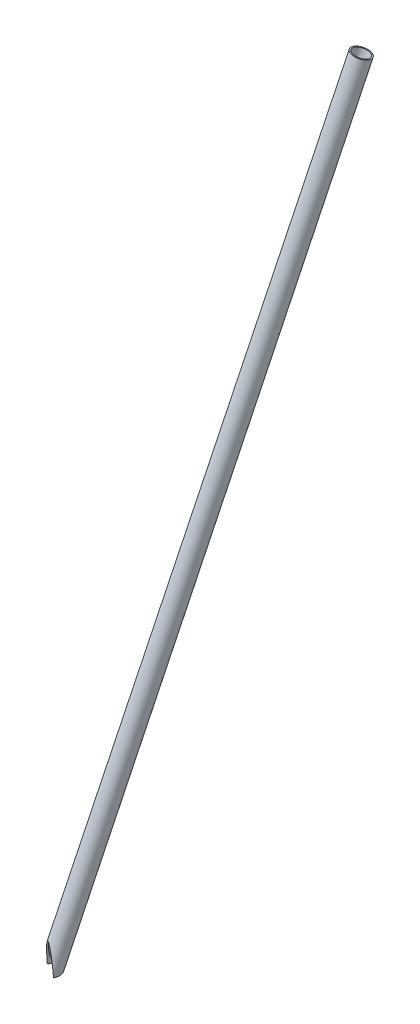
ISO-10303-21;
HEADER;
FILE_DESCRIPTION(('STEP AP214'),'2;1');
FILE_NAME('part.step','',(''),(''),'','','');
FILE_SCHEMA(('AUTOMOTIVE_DESIGN { 1 0 10303 214 1 1 1 1 }'));
ENDSEC;
DATA;
#1=APPLICATION_CONTEXT('core data for automotive mechanical design processes');
#2=APPLICATION_PROTOCOL_DEFINITION('international standard','automotive_design',2000,#1);
#3=PRODUCT_CONTEXT('',#1,'mechanical');
#4=PRODUCT('Part','Part','',(#3));
#5=PRODUCT_RELATED_PRODUCT_CATEGORY('part','',(#4));
#6=PRODUCT_DEFINITION_FORMATION('','',#4);
#7=PRODUCT_DEFINITION_CONTEXT('part definition',#1,'design');
#8=PRODUCT_DEFINITION('design','',#6,#7);
#9=PRODUCT_DEFINITION_SHAPE('','',#8);
#10=(LENGTH_UNIT() NAMED_UNIT(*) SI_UNIT(.MILLI.,.METRE.));
#11=(NAMED_UNIT(*) PLANE_ANGLE_UNIT() SI_UNIT($,.RADIAN.));
#12=(NAMED_UNIT(*) SI_UNIT($,.STERADIAN.) SOLID_ANGLE_UNIT());
#13=UNCERTAINTY_MEASURE_WITH_UNIT(LENGTH_MEASURE(1.E-05),#10,'distance_accuracy_value','');
#14=(GEOMETRIC_REPRESENTATION_CONTEXT(3) GLOBAL_UNCERTAINTY_ASSIGNED_CONTEXT((#13)) GLOBAL_UNIT_ASSIGNED_CONTEXT((#10,
#11,#12)) REPRESENTATION_CONTEXT('',''));
#15=CARTESIAN_POINT('',(0.,0.,0.));
#16=DIRECTION('',(0.,0.,1.));
#17=DIRECTION('',(1.,0.,0.));
#18=AXIS2_PLACEMENT_3D('',#15,#16,#17);
#19=CARTESIAN_POINT('',(-115.,920.,-1946.51325703663));
#20=DIRECTION('',(-0.140336447675245,-0.956366902675742,0.256257739239816));
#21=DIRECTION('',(0.,-0.258819045102517,-0.965925826289069));
#22=AXIS2_PLACEMENT_3D('',#19,#20,#21);
#23=CYLINDRICAL_SURFACE('',#22,9.39999999999998);
#24=CARTESIAN_POINT('',(-115.,920.,-1946.51325703663));
#25=DIRECTION('',(0.140336447675245,0.956366902675757,-0.25625773923976));
#26=DIRECTION('',(0.,0.258819045102461,0.965925826289084));
#27=AXIS2_PLACEMENT_3D('',#24,#25,#26);
#28=CIRCLE('',#27,9.39999999999998);
#29=CARTESIAN_POINT('',(-115.,922.432899023963,-1937.43355426951));
#30=VERTEX_POINT('',#29);
#31=EDGE_CURVE('E82',#30,#30,#28,.T.);
#32=ORIENTED_EDGE('',*,*,#31,.T.);
#33=EDGE_LOOP('',(#32));
#34=FACE_BOUND('',#33,.T.);
#35=CARTESIAN_POINT('',(-249.187093715794,3.10690676470209,-1710.56408925442));
#36=CARTESIAN_POINT('',(-248.92508342383,3.08321310541061,-1710.55773909982));
#37=CARTESIAN_POINT('',(-248.663002634256,3.06270874705635,-1710.54082360263));
#38=CARTESIAN_POINT('',(-248.140694326603,3.02706388530787,-1710.48565682954));
#39=CARTESIAN_POINT('',(-247.88046719588,3.01192447255609,-1710.44740121945));
#40=CARTESIAN_POINT('',(-247.363593267322,2.98623599681016,-1710.34952661938));
#41=CARTESIAN_POINT('',(-247.106949714954,2.97569086280886,-1710.28988942315));
#42=CARTESIAN_POINT('',(-246.599385985328,2.95864335209849,-1710.14948507557));
#43=CARTESIAN_POINT('',(-246.348465496006,2.95214075444945,-1710.06871907932));
#44=CARTESIAN_POINT('',(-245.8541567601,2.94278079040517,-1709.88647935129));
#45=CARTESIAN_POINT('',(-245.61076934013,2.93992382267563,-1709.78500335617));
#46=CARTESIAN_POINT('',(-245.13334470038,2.9376101096076,-1709.56198862529));
#47=CARTESIAN_POINT('',(-244.899307604027,2.93815340913886,-1709.4404496248));
#48=CARTESIAN_POINT('',(-244.442355052878,2.94253110033467,-1709.17818705773));
#49=CARTESIAN_POINT('',(-244.21943670936,2.94636463241379,-1709.03746850996));
#50=CARTESIAN_POINT('',(-243.786257716314,2.95734601101924,-1708.73785670425));
#51=CARTESIAN_POINT('',(-243.575996963565,2.96449383051386,-1708.57896359455));
#52=CARTESIAN_POINT('',(-243.171046714164,2.98220078496964,-1708.24540111253));
#53=CARTESIAN_POINT('',(-242.97625733425,2.99273535975692,-1708.07085165632));
#54=CARTESIAN_POINT('',(-242.601906333155,3.01752860192387,-1707.70636870131));
#55=CARTESIAN_POINT('',(-242.42234470325,3.03178726716954,-1707.51643521134));
#56=CARTESIAN_POINT('',(-242.079554782849,3.06449054861608,-1707.12261715733));
#57=CARTESIAN_POINT('',(-241.916330478228,3.0829361827568,-1706.9187292091));
#58=CARTESIAN_POINT('',(-241.607254112915,3.12465611158026,-1706.49865439916));
#59=CARTESIAN_POINT('',(-241.461402003459,3.14793039270847,-1706.28246757197));
#60=CARTESIAN_POINT('',(-241.186720652856,3.2004018202152,-1705.83762372278));
#61=CARTESIAN_POINT('',(-241.058048444121,3.22964813903503,-1705.60887551418));
#62=CARTESIAN_POINT('',(-240.819892021037,3.29511783795351,-1705.14253198881));
#63=CARTESIAN_POINT('',(-240.710409229458,3.33134173497623,-1704.90493601762));
#64=CARTESIAN_POINT('',(-240.511157657118,3.41230049337391,-1704.42301062551));
#65=CARTESIAN_POINT('',(-240.421389308705,3.45703554136223,-1704.17868105706));
#66=CARTESIAN_POINT('',(-240.261923480868,3.5569820724605,-1703.68567151367));
#67=CARTESIAN_POINT('',(-240.192221650508,3.61219128019081,-1703.43699249422));
#68=CARTESIAN_POINT('',(-240.085241282712,3.72290024283653,-1702.98927007647));
#69=CARTESIAN_POINT('',(-240.044243999528,3.77601312777615,-1702.79051842046));
#70=CARTESIAN_POINT('',(-239.974925251883,3.89191319780647,-1702.39363904376));
#71=CARTESIAN_POINT('',(-239.946601000123,3.95469825151929,-1702.19551119539));
#72=CARTESIAN_POINT('',(-239.902433220347,4.09149374174529,-1701.80208769938));
#73=CARTESIAN_POINT('',(-239.886569735561,4.16548600146989,-1701.60678801676));
#74=CARTESIAN_POINT('',(-239.866805012364,4.32647762284114,-1701.22098943555));
#75=CARTESIAN_POINT('',(-239.862901260381,4.41347424733332,-1701.03048953655));
#76=CARTESIAN_POINT('',(-239.865989319182,4.58558591025853,-1700.6894392696));
#77=CARTESIAN_POINT('',(-239.871202940311,4.66839279195691,-1700.5377067829));
#78=CARTESIAN_POINT('',(-239.888632185935,4.84453085093842,-1700.24089513107));
#79=CARTESIAN_POINT('',(-239.900846835166,4.93786056090631,-1700.09581504228));
#80=CARTESIAN_POINT('',(-239.931452314187,5.13518230507602,-1699.81400330241));
#81=CARTESIAN_POINT('',(-239.949836555511,5.23916288333454,-1699.67726292872));
#82=CARTESIAN_POINT('',(-239.991824635554,5.45762852543314,-1699.41330085474));
#83=CARTESIAN_POINT('',(-240.015428545585,5.57211373277433,-1699.28607928453));
#84=CARTESIAN_POINT('',(-240.066774777882,5.81064602457094,-1699.04232212482));
#85=CARTESIAN_POINT('',(-240.094509567465,5.93467551002928,-1698.92576769565));
#86=CARTESIAN_POINT('',(-240.153146741467,6.1913819473769,-1698.70351462467));
#87=CARTESIAN_POINT('',(-240.184049178627,6.3240590432304,-1698.59781616368));
#88=CARTESIAN_POINT('',(-240.248164339339,6.59688819177488,-1698.39710640458));
#89=CARTESIAN_POINT('',(-240.281379041266,6.73704662097588,-1698.30210444488));
#90=CARTESIAN_POINT('',(-240.349395190217,7.02345813971368,-1698.1223722693));
#91=CARTESIAN_POINT('',(-240.384197201717,7.16971339577837,-1698.03764574737));
#92=CARTESIAN_POINT('',(-240.481794389074,7.58055563050335,-1697.81670861489));
#93=CARTESIAN_POINT('',(-240.545689941029,7.85029380572809,-1697.69053384712));
#94=CARTESIAN_POINT('',(-240.675018532973,8.39963833986357,-1697.46285675128));
#95=CARTESIAN_POINT('',(-240.740452896553,8.67925330630574,-1697.36137658375));
#96=CARTESIAN_POINT('',(-240.872542749044,9.24600627484228,-1697.17801232039));
#97=CARTESIAN_POINT('',(-240.9392025516,9.53317361870246,-1697.09622324173));
#98=CARTESIAN_POINT('',(-241.039815436628,9.96675736495569,-1696.98582181641));
#99=CARTESIAN_POINT('',(-241.073451975291,10.1117360423071,-1696.95107254804));
#100=CARTESIAN_POINT('',(-241.140966302897,10.4024782726514,-1696.88526451319));
#101=CARTESIAN_POINT('',(-241.174844095565,10.5482418377542,-1696.85420580382));
#102=CARTESIAN_POINT('',(-241.262732814703,10.9256766408471,-1696.77825494598));
#103=CARTESIAN_POINT('',(-241.316947774582,11.1578066246424,-1696.73587624198));
#104=CARTESIAN_POINT('',(-241.42621299169,11.6230788563346,-1696.65831726785));
#105=CARTESIAN_POINT('',(-241.481263340733,11.8562212134559,-1696.62313779519));
#106=CARTESIAN_POINT('',(-241.647972317062,12.5567447352365,-1696.52694116163));
#107=CARTESIAN_POINT('',(-241.761151761722,13.0250613648398,-1696.47529666787));
#108=CARTESIAN_POINT('',(-241.993251890765,13.9629714019594,-1696.39163412689));
#109=CARTESIAN_POINT('',(-242.11218397253,14.4325654459698,-1696.3596569201));
#110=CARTESIAN_POINT('',(-242.35703552946,15.3706493180546,-1696.31227240429));
#111=CARTESIAN_POINT('',(-242.482953515765,15.8391393593986,-1696.29686157875));
#112=CARTESIAN_POINT('',(-242.743658657562,16.7753184834324,-1696.28061259514));
#113=CARTESIAN_POINT('',(-242.878469852432,17.2430015692695,-1696.27981570786));
#114=CARTESIAN_POINT('',(-243.158256451335,18.1752011880335,-1696.29184383883));
#115=CARTESIAN_POINT('',(-243.30323289135,18.6397173929013,-1696.30467024738));
#116=CARTESIAN_POINT('',(-243.604878871943,19.56352042766,-1696.3435626612));
#117=CARTESIAN_POINT('',(-243.761527959689,20.0228148515539,-1696.36960595253));
#118=CARTESIAN_POINT('',(-244.088828949743,20.9353395656401,-1696.43518670408));
#119=CARTESIAN_POINT('',(-244.259478241141,21.3885709682774,-1696.47472165256));
#120=CARTESIAN_POINT('',(-244.619461844428,22.2920387844417,-1696.56871512693));
#121=CARTESIAN_POINT('',(-244.808984149356,22.7421846883044,-1696.62333595764));
#122=CARTESIAN_POINT('',(-245.108804278604,23.4088956362845,-1696.71764633162));
#123=CARTESIAN_POINT('',(-245.211388222966,23.629821537216,-1696.75116590967));
#124=CARTESIAN_POINT('',(-245.422297375453,24.068196564008,-1696.82265925191));
#125=CARTESIAN_POINT('',(-245.530622476767,24.2856457544529,-1696.86063293326));
#126=CARTESIAN_POINT('',(-245.753060276646,24.7151728856837,-1696.94120675272));
#127=CARTESIAN_POINT('',(-245.867138466183,24.9272735325961,-1696.98378073026));
#128=CARTESIAN_POINT('',(-246.102368780546,25.3463604736014,-1697.07420315001));
#129=CARTESIAN_POINT('',(-246.223520166999,25.5533472983286,-1697.12205104213));
#130=CARTESIAN_POINT('',(-246.473630628814,25.9607020180095,-1697.22355547236));
#131=CARTESIAN_POINT('',(-246.60257861837,26.161078712646,-1697.27720384471));
#132=CARTESIAN_POINT('',(-246.869442270967,26.5537787488482,-1697.39108461375));
#133=CARTESIAN_POINT('',(-247.007354471445,26.7461051533223,-1697.4513144743));
#134=CARTESIAN_POINT('',(-247.266502256411,27.0852520766507,-1697.56724432355));
#135=CARTESIAN_POINT('',(-247.386000100158,27.2338312028283,-1697.62166789748));
#136=CARTESIAN_POINT('',(-247.632474398193,27.5225337869271,-1697.73604127566));
#137=CARTESIAN_POINT('',(-247.759452420366,27.6626554595694,-1697.79599223999));
#138=CARTESIAN_POINT('',(-248.021243802004,27.9318348997381,-1697.92187188684));
#139=CARTESIAN_POINT('',(-248.156036361792,28.0609199616297,-1697.98778494088));
#140=CARTESIAN_POINT('',(-248.434238991779,28.3053943669363,-1698.12628855933));
#141=CARTESIAN_POINT('',(-248.577642902614,28.4207933277921,-1698.19887437027));
#142=CARTESIAN_POINT('',(-248.900091481253,28.6534936808748,-1698.3650157199));
#143=CARTESIAN_POINT('',(-249.080904468378,28.7673967740042,-1698.4599937935));
#144=CARTESIAN_POINT('',(-249.454140206472,28.9632160968927,-1698.66024174985));
#145=CARTESIAN_POINT('',(-249.646552707546,29.0451601024433,-1698.76550259584));
#146=CARTESIAN_POINT('',(-249.942058204724,29.1383503847701,-1698.93058547313));
#147=CARTESIAN_POINT('',(-250.042354511122,29.1645276140485,-1698.98718721022));
#148=CARTESIAN_POINT('',(-250.244129820051,29.2057992201556,-1699.1022459676));
#149=CARTESIAN_POINT('',(-250.345608187364,29.2208992936524,-1699.16070201812));
#150=CARTESIAN_POINT('',(-250.548785541522,29.239452689379,-1699.2789549209));
#151=CARTESIAN_POINT('',(-250.650484379055,29.2429123170221,-1699.3387510296));
#152=CARTESIAN_POINT('',(-250.853106069153,29.2380708473942,-1699.45910531977));
#153=CARTESIAN_POINT('',(-250.954028989415,29.2297707881257,-1699.5196634335));
#154=CARTESIAN_POINT('',(-251.2270477709,29.1913512136256,-1699.68514615762));
#155=CARTESIAN_POINT('',(-251.397500997016,29.1497500189109,-1699.79029266634));
#156=CARTESIAN_POINT('',(-251.729112844855,29.0358938190713,-1699.99830114113));
#157=CARTESIAN_POINT('',(-251.890264158997,28.9636150762025,-1700.10116127304));
#158=CARTESIAN_POINT('',(-252.274588924131,28.7538528014395,-1700.35044206465));
#159=CARTESIAN_POINT('',(-252.491205251046,28.6016928342282,-1700.49454950582));
#160=CARTESIAN_POINT('',(-252.899519302192,28.259228031029,-1700.77227823178));
#161=CARTESIAN_POINT('',(-253.091147647198,28.0688205695831,-1700.90586992892));
#162=CARTESIAN_POINT('',(-253.432945057199,27.6833580222573,-1701.1493599779));
#163=CARTESIAN_POINT('',(-253.585354344393,27.4908795972533,-1701.26027430998));
#164=CARTESIAN_POINT('',(-253.874561794189,27.0906276654037,-1701.47487395748));
#165=CARTESIAN_POINT('',(-254.011346440623,26.8828411679998,-1701.57855298425));
#166=CARTESIAN_POINT('',(-254.271566643078,26.4556057051317,-1701.77972142836));
#167=CARTESIAN_POINT('',(-254.394973043471,26.2361327628256,-1701.87719714314));
#168=CARTESIAN_POINT('',(-254.629851813874,25.7887231053787,-1702.06653700746));
#169=CARTESIAN_POINT('',(-254.741328056163,25.5607891690501,-1702.15840297361));
#170=CARTESIAN_POINT('',(-254.995608142614,25.0075053717328,-1702.37244020702));
#171=CARTESIAN_POINT('',(-255.133528543212,24.6790429911247,-1702.49234937641));
#172=CARTESIAN_POINT('',(-255.392295172905,24.0127494030805,-1702.72451711226));
#173=CARTESIAN_POINT('',(-255.513133916034,23.6749141651371,-1702.83677231332));
#174=CARTESIAN_POINT('',(-255.740122104595,22.9917217228773,-1703.05511450082));
#175=CARTESIAN_POINT('',(-255.846245987482,22.646352605725,-1703.16119057211));
#176=CARTESIAN_POINT('',(-256.045223390285,21.9503476353634,-1703.36807004385));
#177=CARTESIAN_POINT('',(-256.138078913845,21.5997125862142,-1703.46887423894));
#178=CARTESIAN_POINT('',(-256.312246442631,20.8923921056825,-1703.66672598743));
#179=CARTESIAN_POINT('',(-256.393493197375,20.5356841893621,-1703.76375023525));
#180=CARTESIAN_POINT('',(-256.544748144316,19.8189759002864,-1703.95434311976));
#181=CARTESIAN_POINT('',(-256.614755919503,19.4589754058872,-1704.04791162815));
#182=CARTESIAN_POINT('',(-256.744068029185,18.7367934343956,-1704.23231824865));
#183=CARTESIAN_POINT('',(-256.803383737829,18.3746147035722,-1704.32315917555));
#184=CARTESIAN_POINT('',(-256.911747306292,17.6482899934146,-1704.50303199878));
#185=CARTESIAN_POINT('',(-256.960795420937,17.2841440631334,-1704.59206393995));
#186=CARTESIAN_POINT('',(-257.042946691509,16.6022316631393,-1704.75757032108));
#187=CARTESIAN_POINT('',(-257.077297191309,16.284642862703,-1704.8341609785));
#188=CARTESIAN_POINT('',(-257.138196191473,15.648695258535,-1704.9872437734));
#189=CARTESIAN_POINT('',(-257.164744767764,15.3303364623273,-1705.06373591183));
#190=CARTESIAN_POINT('',(-257.209769149735,14.6928924138074,-1705.21738950902));
#191=CARTESIAN_POINT('',(-257.228237440613,14.3738067615027,-1705.29455152306));
#192=CARTESIAN_POINT('',(-257.256548829066,13.7355990406489,-1705.45028687266));
#193=CARTESIAN_POINT('',(-257.266392160834,13.416476973324,-1705.52886016984));
#194=CARTESIAN_POINT('',(-257.276621020291,12.7805156546868,-1705.68793235798));
#195=CARTESIAN_POINT('',(-257.27706104638,12.463673894402,-1705.76841744512));
#196=CARTESIAN_POINT('',(-257.267454267582,11.8310005412856,-1705.9329295956));
#197=CARTESIAN_POINT('',(-257.257405997076,11.5151690958205,-1706.0169571524));
#198=CARTESIAN_POINT('',(-257.225156264311,10.8859253692859,-1706.18985896128));
#199=CARTESIAN_POINT('',(-257.202972510928,10.5725102363754,-1706.27872598157));
#200=CARTESIAN_POINT('',(-257.144084706068,9.94907922871935,-1706.46315350849));
#201=CARTESIAN_POINT('',(-257.107386422074,9.63906205398962,-1706.55871134407));
#202=CARTESIAN_POINT('',(-257.03011377312,9.11897103844865,-1706.72790700723));
#203=CARTESIAN_POINT('',(-256.994197578042,8.90746573083951,-1706.79925490866));
#204=CARTESIAN_POINT('',(-256.912283618211,8.48811449215313,-1706.94695111884));
#205=CARTESIAN_POINT('',(-256.866284768222,8.28026895759505,-1707.02329996524));
#206=CARTESIAN_POINT('',(-256.762511168979,7.8699733802251,-1707.18161339315));
#207=CARTESIAN_POINT('',(-256.704750711512,7.66751712321778,-1707.26357107975));
#208=CARTESIAN_POINT('',(-256.57540895478,7.26973272133173,-1707.43371989814));
#209=CARTESIAN_POINT('',(-256.503831259773,7.07440273331509,-1707.52190940055));
#210=CARTESIAN_POINT('',(-256.360859861998,6.7319111790162,-1707.68614890131));
#211=CARTESIAN_POINT('',(-256.29235541915,6.58299601518102,-1707.76104787688));
#212=CARTESIAN_POINT('',(-256.144277320805,6.29277598965956,-1707.91460288962));
#213=CARTESIAN_POINT('',(-256.064704949973,6.15147024737626,-1707.99325849007));
#214=CARTESIAN_POINT('',(-255.89393492036,5.87819095626933,-1708.1535466273));
#215=CARTESIAN_POINT('',(-255.802755081073,5.74620357508365,-1708.23517446684));
#216=CARTESIAN_POINT('',(-255.608417755413,5.49269103955761,-1708.40042935497));
#217=CARTESIAN_POINT('',(-255.505260473204,5.37116570694472,-1708.48405636946));
#218=CARTESIAN_POINT('',(-255.2868553501,5.13917572585977,-1708.65213293812));
#219=CARTESIAN_POINT('',(-255.171569109719,5.02874851040144,-1708.73658428697));
#220=CARTESIAN_POINT('',(-254.929908495342,4.81983579413514,-1708.90436616843));
#221=CARTESIAN_POINT('',(-254.803533856502,4.72135057869399,-1708.98769667422));
#222=CARTESIAN_POINT('',(-254.540501880499,4.53598082414195,-1709.1517116723));
#223=CARTESIAN_POINT('',(-254.40382489505,4.4491193758092,-1709.23239066446));
#224=CARTESIAN_POINT('',(-254.121627058011,4.28656760397982,-1709.38939622568));
#225=CARTESIAN_POINT('',(-253.97610501908,4.21087878497041,-1709.46572220773));
#226=CARTESIAN_POINT('',(-253.64240403074,4.05315073300768,-1709.62995674827));
#227=CARTESIAN_POINT('',(-253.452227752296,3.97378837208524,-1709.71638099842));
#228=CARTESIAN_POINT('',(-253.062441105878,3.82856312122192,-1709.87864791412));
#229=CARTESIAN_POINT('',(-252.862828180912,3.76270391625175,-1709.95448768939));
#230=CARTESIAN_POINT('',(-252.456035244613,3.64242849808371,-1710.09416226874));
#231=CARTESIAN_POINT('',(-252.248852379841,3.58801665322657,-1710.15799248896));
#232=CARTESIAN_POINT('',(-251.82868759569,3.48883577873689,-1710.27254837194));
#233=CARTESIAN_POINT('',(-251.615706528915,3.44406533990811,-1710.32327595002));
#234=CARTESIAN_POINT('',(-251.220113701224,3.36916641003924,-1710.40380084436));
#235=CARTESIAN_POINT('',(-251.038140973246,3.33784101570868,-1710.4356539593));
#236=CARTESIAN_POINT('',(-250.671905728991,3.28008695927633,-1710.48926867438));
#237=CARTESIAN_POINT('',(-250.487642753738,3.25365929615161,-1710.51102821711));
#238=CARTESIAN_POINT('',(-250.117714899672,3.20506263241454,-1710.54417013349));
#239=CARTESIAN_POINT('',(-249.932050695464,3.18289170338052,-1710.55555721495));
#240=CARTESIAN_POINT('',(-249.559967507671,3.14224419110757,-1710.5677767004));
#241=CARTESIAN_POINT('',(-249.373548462405,3.12376791624837,-1710.56860822372));
#242=CARTESIAN_POINT('',(-249.187093715794,3.10690676470209,-1710.56408925442));
#243=B_SPLINE_CURVE_WITH_KNOTS('',3,(#35,#36,#37,#38,#39,#40,#41,#42,#43,#44,#45,#46,#47,#48,
#49,#50,#51,#52,#53,#54,#55,#56,#57,#58,#59,#60,#61,#62,#63,#64,#65,#66,#67,#68,#69,#70,#71,#72,
#73,#74,#75,#76,#77,#78,#79,#80,#81,#82,#83,#84,#85,#86,#87,#88,#89,#90,#91,#92,#93,#94,#95,#96,
#97,#98,#99,#100,#101,#102,#103,#104,#105,#106,#107,#108,#109,#110,#111,#112,#113,#114,#115,
#116,#117,#118,#119,#120,#121,#122,#123,#124,#125,#126,#127,#128,#129,#130,#131,#132,#133,#134,
#135,#136,#137,#138,#139,#140,#141,#142,#143,#144,#145,#146,#147,#148,#149,#150,#151,#152,#153,
#154,#155,#156,#157,#158,#159,#160,#161,#162,#163,#164,#165,#166,#167,#168,#169,#170,#171,#172,
#173,#174,#175,#176,#177,#178,#179,#180,#181,#182,#183,#184,#185,#186,#187,#188,#189,#190,#191,
#192,#193,#194,#195,#196,#197,#198,#199,#200,#201,#202,#203,#204,#205,#206,#207,#208,#209,#210,
#211,#212,#213,#214,#215,#216,#217,#218,#219,#220,#221,#222,#223,#224,#225,#226,#227,#228,#229,
#230,#231,#232,#233,#234,#235,#236,#237,#238,#239,#240,#241,#242),.UNSPECIFIED.,.T.,.F.,(4,2,2,
2,2,2,2,2,2,2,2,2,2,2,2,2,2,2,2,2,2,2,2,2,2,2,2,2,2,2,2,2,2,2,2,2,2,2,2,2,2,2,2,2,2,2,2,2,2,2,2,
2,2,2,2,2,2,2,2,2,2,2,2,2,2,2,2,2,2,2,2,2,2,2,2,2,2,2,2,2,2,2,2,2,2,2,2,2,2,2,2,2,2,2,2,2,2,2,2,
2,2,2,2,4),(0.,0.789303535363006,1.57876743670573,2.36890516273568,3.15899970093794,
3.94918063205766,4.73937199038651,5.52935697111558,6.31933550874973,7.10370980615385,
7.88808365409112,8.67264840438273,9.45721095234931,10.2485146531994,11.0398769992321,
11.8312566984758,12.6224646768682,13.2512287671765,13.8798544994824,14.5074713802774,
15.1349563459997,15.6532226262278,16.1714167279796,16.6890592053527,17.2067087551629,
17.7234256697897,18.2401511888466,18.7573243847248,19.2746829531681,20.1867398790386,
21.0996122770562,22.0168051080077,22.4752677579888,22.9337375018419,23.6599415990909,
24.3862260956689,25.839298609309,27.2953784256137,28.7511491004008,30.2110303430487,
31.6710605852349,33.1285901385098,34.5858484909564,36.0594405960702,36.7969648051367,
37.5344752977407,38.2679929280382,39.001434122665,39.733855920228,40.4659964708305,
41.0605242447981,41.6551770815173,42.248313981664,42.8410315739313,43.5404653986095,
44.2392899802295,44.5931384261841,44.9468047700605,45.3002795085747,45.6537230485711,
46.2643288177372,46.8754079266908,47.7744385222854,48.6759144125641,49.4829492792425,
50.2906770711879,51.1001312068814,51.9093218087332,53.0362049054489,54.1635803329651,
55.2928903278699,56.4220296059963,57.5572849367484,58.6925823801511,59.8266648810877,
60.9607192324874,61.9461137499314,62.9314986773468,63.9177980915573,64.9040707242193,
65.8846256920036,66.8653176993728,67.8445824207914,68.8234584127286,69.5014698746155,
70.1795543493675,70.8568197336968,71.5339086900616,72.0740897758596,72.6142082145006,
73.1535072564706,73.6927971070059,74.2338488485837,74.7749135166232,75.3170375479709,
75.8592345143522,76.5286491355889,77.1982461956265,77.8680983139223,78.5378524595033,
79.0996394681906,79.6615409372557,80.2231872451945,80.7848804122166),.UNSPECIFIED.);
#244=CARTESIAN_POINT('',(-249.187093715794,3.10690676470209,-1710.56408925442));
#245=VERTEX_POINT('',#244);
#246=EDGE_CURVE('E46',#245,#245,#243,.T.);
#247=ORIENTED_EDGE('',*,*,#246,.T.);
#248=EDGE_LOOP('',(#247));
#249=FACE_BOUND('',#248,.T.);
#250=ADVANCED_FACE('F41',(#34,#249),#23,.F.);
#251=CARTESIAN_POINT('',(-115.,920.,-1946.51325703663));
#252=DIRECTION('',(-0.140336447675245,-0.956366902675742,0.256257739239816));
#253=DIRECTION('',(0.,-0.258819045102517,-0.965925826289069));
#254=AXIS2_PLACEMENT_3D('',#251,#252,#253);
#255=CYLINDRICAL_SURFACE('',#254,11.);
#256=CARTESIAN_POINT('',(-115.,920.,-1946.51325703663));
#257=DIRECTION('',(0.140336447675245,0.956366902675757,-0.25625773923976));
#258=DIRECTION('',(0.,0.258819045102461,0.965925826289084));
#259=AXIS2_PLACEMENT_3D('',#256,#257,#258);
#260=CIRCLE('',#259,11.);
#261=CARTESIAN_POINT('',(-115.,922.847009496127,-1935.88807294745));
#262=VERTEX_POINT('',#261);
#263=EDGE_CURVE('E63',#262,#262,#260,.T.);
#264=ORIENTED_EDGE('',*,*,#263,.F.);
#265=EDGE_LOOP('',(#264));
#266=FACE_BOUND('',#265,.T.);
#267=CARTESIAN_POINT('',(-250.,0.,-1700.));
#268=DIRECTION('',(-0.508456010272344,-0.0599232902931692,0.859000398660194));
#269=DIRECTION('',(0.0394871934442316,-0.998148808069163,-0.0462570913915509));
#270=AXIS2_PLACEMENT_3D('',#267,#268,#269);
#271=ELLIPSE('',#270,31.5376862377806,11.);
#272=CARTESIAN_POINT('',(-240.537996887139,0.114398006523072,-1694.39130940519));
#273=VERTEX_POINT('',#272);
#274=CARTESIAN_POINT('',(-259.462003112861,-0.114398006522879,-1705.60869059481));
#275=VERTEX_POINT('',#274);
#276=EDGE_CURVE('E56',#273,#275,#271,.T.);
#277=ORIENTED_EDGE('',*,*,#276,.F.);
#278=CARTESIAN_POINT('',(-250.,0.,-1700.));
#279=DIRECTION('',(0.0394871934442316,-0.998148808069163,-0.0462570913915509));
#280=DIRECTION('',(-0.508456010272344,-0.0599232902931692,0.859000398660194));
#281=AXIS2_PLACEMENT_3D('',#278,#279,#280);
#282=ELLIPSE('',#281,11.7370734990693,11.);
#283=EDGE_CURVE('E11',#275,#273,#282,.T.);
#284=ORIENTED_EDGE('',*,*,#283,.F.);
#285=EDGE_LOOP('',(#277,#284));
#286=FACE_BOUND('',#285,.T.);
#287=ADVANCED_FACE('F65',(#266,#286),#255,.T.);
#288=CARTESIAN_POINT('',(-115.,920.,-1946.51325703663));
#289=DIRECTION('',(0.140336447675245,0.956366902675757,-0.25625773923976));
#290=DIRECTION('',(0.,0.258819045102461,0.965925826289084));
#291=AXIS2_PLACEMENT_3D('',#288,#289,#290);
#292=PLANE('',#291);
#293=ORIENTED_EDGE('',*,*,#31,.F.);
#294=EDGE_LOOP('',(#293));
#295=FACE_BOUND('',#294,.T.);
#296=ORIENTED_EDGE('',*,*,#263,.T.);
#297=EDGE_LOOP('',(#296));
#298=FACE_BOUND('',#297,.T.);
#299=ADVANCED_FACE('F67',(#295,#298),#292,.T.);
#300=CARTESIAN_POINT('',(-250.,0.,-1700.));
#301=DIRECTION('',(-0.214351342090107,0.914565726251124,0.342962147344171));
#302=DIRECTION('',(0.,-0.351123441588391,0.936329177569045));
#303=AXIS2_PLACEMENT_3D('',#300,#301,#302);
#304=CYLINDRICAL_SURFACE('',#303,11.);
#305=ORIENTED_EDGE('',*,*,#246,.F.);
#306=EDGE_LOOP('',(#305));
#307=FACE_BOUND('',#306,.T.);
#308=ORIENTED_EDGE('',*,*,#276,.T.);
#309=ORIENTED_EDGE('',*,*,#283,.T.);
#310=EDGE_LOOP('',(#308,#309));
#311=FACE_BOUND('',#310,.T.);
#312=ADVANCED_FACE('F43',(#307,#311),#304,.F.);
#313=CLOSED_SHELL('',(#250,#287,#299,#312));
#314=MANIFOLD_SOLID_BREP('B2',#313);
#315=ADVANCED_BREP_SHAPE_REPRESENTATION('',(#18,#314),#14);
#316=SHAPE_DEFINITION_REPRESENTATION(#9,#315);
ENDSEC;
END-ISO-10303-21;
